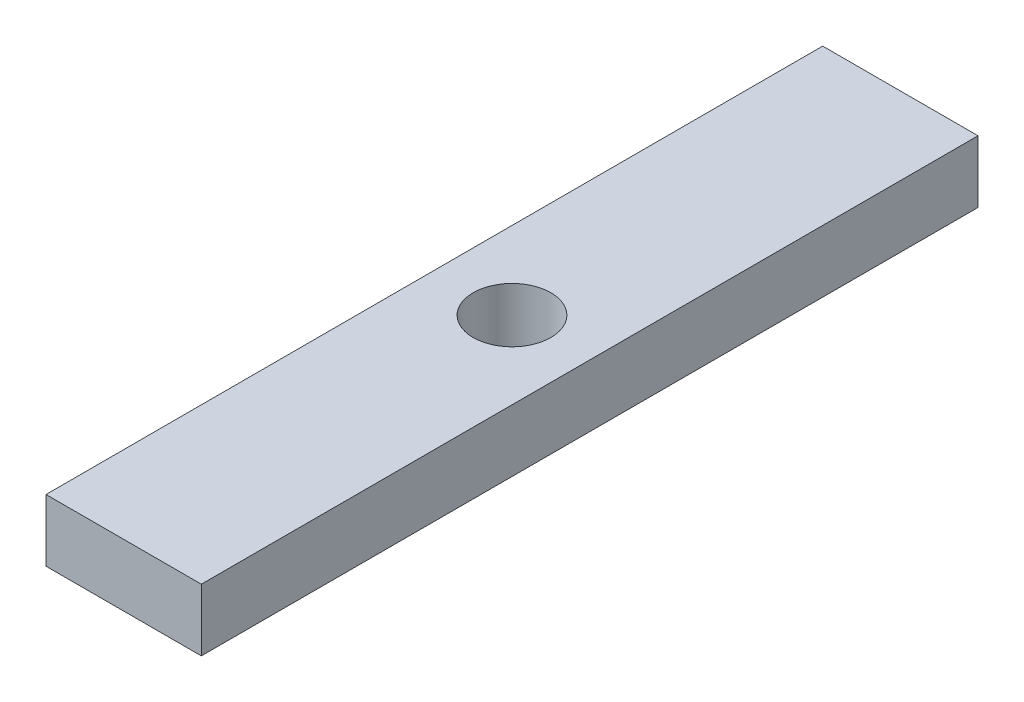
ISO-10303-21;
HEADER;
FILE_DESCRIPTION(('STEP AP214'),'2;1');
FILE_NAME('part.step','',(''),(''),'','','');
FILE_SCHEMA(('AUTOMOTIVE_DESIGN { 1 0 10303 214 1 1 1 1 }'));
ENDSEC;
DATA;
#1=APPLICATION_CONTEXT('core data for automotive mechanical design processes');
#2=APPLICATION_PROTOCOL_DEFINITION('international standard','automotive_design',2000,#1);
#3=PRODUCT_CONTEXT('',#1,'mechanical');
#4=PRODUCT('Part','Part','',(#3));
#5=PRODUCT_RELATED_PRODUCT_CATEGORY('part','',(#4));
#6=PRODUCT_DEFINITION_FORMATION('','',#4);
#7=PRODUCT_DEFINITION_CONTEXT('part definition',#1,'design');
#8=PRODUCT_DEFINITION('design','',#6,#7);
#9=PRODUCT_DEFINITION_SHAPE('','',#8);
#10=(LENGTH_UNIT() NAMED_UNIT(*) SI_UNIT(.MILLI.,.METRE.));
#11=(NAMED_UNIT(*) PLANE_ANGLE_UNIT() SI_UNIT($,.RADIAN.));
#12=(NAMED_UNIT(*) SI_UNIT($,.STERADIAN.) SOLID_ANGLE_UNIT());
#13=UNCERTAINTY_MEASURE_WITH_UNIT(LENGTH_MEASURE(1.E-05),#10,'distance_accuracy_value','');
#14=(GEOMETRIC_REPRESENTATION_CONTEXT(3) GLOBAL_UNCERTAINTY_ASSIGNED_CONTEXT((#13)) GLOBAL_UNIT_ASSIGNED_CONTEXT((#10,
#11,#12)) REPRESENTATION_CONTEXT('',''));
#15=CARTESIAN_POINT('',(0.,0.,0.));
#16=DIRECTION('',(0.,0.,1.));
#17=DIRECTION('',(1.,0.,0.));
#18=AXIS2_PLACEMENT_3D('',#15,#16,#17);
#19=CARTESIAN_POINT('',(-10.,8.,-100.));
#20=DIRECTION('',(1.,0.,0.));
#21=DIRECTION('',(0.,0.,-1.));
#22=AXIS2_PLACEMENT_3D('',#19,#20,#21);
#23=PLANE('',#22);
#24=DIRECTION('',(0.,0.,1.));
#25=VECTOR('',#24,1.);
#26=CARTESIAN_POINT('',(-10.,0.,-100.));
#27=LINE('',#26,#25);
#28=CARTESIAN_POINT('',(-10.,0.,-100.));
#29=VERTEX_POINT('',#28);
#30=CARTESIAN_POINT('',(-10.,0.,0.));
#31=VERTEX_POINT('',#30);
#32=EDGE_CURVE('E106',#29,#31,#27,.T.);
#33=ORIENTED_EDGE('',*,*,#32,.T.);
#34=DIRECTION('',(0.,-1.,0.));
#35=VECTOR('',#34,1.);
#36=CARTESIAN_POINT('',(-10.,8.,0.));
#37=LINE('',#36,#35);
#38=CARTESIAN_POINT('',(-10.,8.,0.));
#39=VERTEX_POINT('',#38);
#40=EDGE_CURVE('E11',#39,#31,#37,.T.);
#41=ORIENTED_EDGE('',*,*,#40,.F.);
#42=DIRECTION('',(0.,0.,1.));
#43=VECTOR('',#42,1.);
#44=CARTESIAN_POINT('',(-10.,8.,-100.));
#45=LINE('',#44,#43);
#46=CARTESIAN_POINT('',(-10.,8.,-100.));
#47=VERTEX_POINT('',#46);
#48=EDGE_CURVE('E93',#47,#39,#45,.T.);
#49=ORIENTED_EDGE('',*,*,#48,.F.);
#50=DIRECTION('',(0.,-1.,0.));
#51=VECTOR('',#50,1.);
#52=CARTESIAN_POINT('',(-10.,8.,-100.));
#53=LINE('',#52,#51);
#54=EDGE_CURVE('E102',#47,#29,#53,.T.);
#55=ORIENTED_EDGE('',*,*,#54,.T.);
#56=EDGE_LOOP('',(#33,#41,#49,#55));
#57=FACE_BOUND('',#56,.T.);
#58=ADVANCED_FACE('F41',(#57),#23,.F.);
#59=CARTESIAN_POINT('',(-10.,8.,0.));
#60=DIRECTION('',(0.,0.,-1.));
#61=DIRECTION('',(-1.,0.,0.));
#62=AXIS2_PLACEMENT_3D('',#59,#60,#61);
#63=PLANE('',#62);
#64=DIRECTION('',(1.,0.,0.));
#65=VECTOR('',#64,1.);
#66=CARTESIAN_POINT('',(-10.,0.,0.));
#67=LINE('',#66,#65);
#68=CARTESIAN_POINT('',(10.,0.,0.));
#69=VERTEX_POINT('',#68);
#70=EDGE_CURVE('E97',#31,#69,#67,.T.);
#71=ORIENTED_EDGE('',*,*,#70,.T.);
#72=DIRECTION('',(0.,-1.,0.));
#73=VECTOR('',#72,1.);
#74=CARTESIAN_POINT('',(10.,8.,0.));
#75=LINE('',#74,#73);
#76=CARTESIAN_POINT('',(10.,8.,0.));
#77=VERTEX_POINT('',#76);
#78=EDGE_CURVE('E50',#77,#69,#75,.T.);
#79=ORIENTED_EDGE('',*,*,#78,.F.);
#80=DIRECTION('',(1.,0.,0.));
#81=VECTOR('',#80,1.);
#82=CARTESIAN_POINT('',(-10.,8.,0.));
#83=LINE('',#82,#81);
#84=EDGE_CURVE('E88',#39,#77,#83,.T.);
#85=ORIENTED_EDGE('',*,*,#84,.F.);
#86=ORIENTED_EDGE('',*,*,#40,.T.);
#87=EDGE_LOOP('',(#71,#79,#85,#86));
#88=FACE_BOUND('',#87,.T.);
#89=ADVANCED_FACE('F96',(#88),#63,.F.);
#90=CARTESIAN_POINT('',(9.99999999999998,8.,-100.));
#91=DIRECTION('',(-1.,0.,0.));
#92=DIRECTION('',(0.,0.,1.));
#93=AXIS2_PLACEMENT_3D('',#90,#91,#92);
#94=PLANE('',#93);
#95=DIRECTION('',(0.,0.,-1.));
#96=VECTOR('',#95,1.);
#97=CARTESIAN_POINT('',(9.99999999999998,0.,-100.));
#98=LINE('',#97,#96);
#99=CARTESIAN_POINT('',(9.99999999999998,0.,-100.));
#100=VERTEX_POINT('',#99);
#101=EDGE_CURVE('E75',#69,#100,#98,.T.);
#102=ORIENTED_EDGE('',*,*,#101,.T.);
#103=DIRECTION('',(0.,-1.,0.));
#104=VECTOR('',#103,1.);
#105=CARTESIAN_POINT('',(9.99999999999998,8.,-100.));
#106=LINE('',#105,#104);
#107=CARTESIAN_POINT('',(9.99999999999998,8.,-100.));
#108=VERTEX_POINT('',#107);
#109=EDGE_CURVE('E98',#108,#100,#106,.T.);
#110=ORIENTED_EDGE('',*,*,#109,.F.);
#111=DIRECTION('',(0.,0.,-1.));
#112=VECTOR('',#111,1.);
#113=CARTESIAN_POINT('',(9.99999999999998,8.,-100.));
#114=LINE('',#113,#112);
#115=EDGE_CURVE('E91',#77,#108,#114,.T.);
#116=ORIENTED_EDGE('',*,*,#115,.F.);
#117=ORIENTED_EDGE('',*,*,#78,.T.);
#118=EDGE_LOOP('',(#102,#110,#116,#117));
#119=FACE_BOUND('',#118,.T.);
#120=ADVANCED_FACE('F100',(#119),#94,.F.);
#121=CARTESIAN_POINT('',(-10.,8.,-100.));
#122=DIRECTION('',(0.,0.,1.));
#123=DIRECTION('',(1.,0.,0.));
#124=AXIS2_PLACEMENT_3D('',#121,#122,#123);
#125=PLANE('',#124);
#126=DIRECTION('',(-1.,0.,0.));
#127=VECTOR('',#126,1.);
#128=CARTESIAN_POINT('',(-10.,0.,-100.));
#129=LINE('',#128,#127);
#130=EDGE_CURVE('E81',#100,#29,#129,.T.);
#131=ORIENTED_EDGE('',*,*,#130,.T.);
#132=ORIENTED_EDGE('',*,*,#54,.F.);
#133=DIRECTION('',(-1.,0.,0.));
#134=VECTOR('',#133,1.);
#135=CARTESIAN_POINT('',(-10.,8.,-100.));
#136=LINE('',#135,#134);
#137=EDGE_CURVE('E58',#108,#47,#136,.T.);
#138=ORIENTED_EDGE('',*,*,#137,.F.);
#139=ORIENTED_EDGE('',*,*,#109,.T.);
#140=EDGE_LOOP('',(#131,#132,#138,#139));
#141=FACE_BOUND('',#140,.T.);
#142=ADVANCED_FACE('F113',(#141),#125,.F.);
#143=CARTESIAN_POINT('',(0.,8.,0.));
#144=DIRECTION('',(0.,1.,0.));
#145=DIRECTION('',(0.,0.,1.));
#146=AXIS2_PLACEMENT_3D('',#143,#144,#145);
#147=PLANE('',#146);
#148=CARTESIAN_POINT('',(0.,8.,-50.));
#149=DIRECTION('',(0.,1.,0.));
#150=DIRECTION('',(0.,0.,1.));
#151=AXIS2_PLACEMENT_3D('',#148,#149,#150);
#152=CIRCLE('',#151,5.);
#153=CARTESIAN_POINT('',(0.,8.,-45.));
#154=VERTEX_POINT('',#153);
#155=EDGE_CURVE('E119',#154,#154,#152,.T.);
#156=ORIENTED_EDGE('',*,*,#155,.F.);
#157=EDGE_LOOP('',(#156));
#158=FACE_BOUND('',#157,.T.);
#159=ORIENTED_EDGE('',*,*,#48,.T.);
#160=ORIENTED_EDGE('',*,*,#84,.T.);
#161=ORIENTED_EDGE('',*,*,#115,.T.);
#162=ORIENTED_EDGE('',*,*,#137,.T.);
#163=EDGE_LOOP('',(#159,#160,#161,#162));
#164=FACE_BOUND('',#163,.T.);
#165=ADVANCED_FACE('F89',(#158,#164),#147,.T.);
#166=CARTESIAN_POINT('',(0.,0.,0.));
#167=DIRECTION('',(0.,1.,0.));
#168=DIRECTION('',(0.,0.,1.));
#169=AXIS2_PLACEMENT_3D('',#166,#167,#168);
#170=PLANE('',#169);
#171=CARTESIAN_POINT('',(0.,0.,-50.));
#172=DIRECTION('',(0.,1.,0.));
#173=DIRECTION('',(0.,0.,1.));
#174=AXIS2_PLACEMENT_3D('',#171,#172,#173);
#175=CIRCLE('',#174,5.);
#176=CARTESIAN_POINT('',(0.,0.,-45.));
#177=VERTEX_POINT('',#176);
#178=EDGE_CURVE('E44',#177,#177,#175,.T.);
#179=ORIENTED_EDGE('',*,*,#178,.T.);
#180=EDGE_LOOP('',(#179));
#181=FACE_BOUND('',#180,.T.);
#182=ORIENTED_EDGE('',*,*,#32,.F.);
#183=ORIENTED_EDGE('',*,*,#130,.F.);
#184=ORIENTED_EDGE('',*,*,#101,.F.);
#185=ORIENTED_EDGE('',*,*,#70,.F.);
#186=EDGE_LOOP('',(#182,#183,#184,#185));
#187=FACE_BOUND('',#186,.T.);
#188=ADVANCED_FACE('F116',(#181,#187),#170,.F.);
#189=CARTESIAN_POINT('',(0.,-2.,-50.));
#190=DIRECTION('',(0.,1.,0.));
#191=DIRECTION('',(0.,0.,1.));
#192=AXIS2_PLACEMENT_3D('',#189,#190,#191);
#193=CYLINDRICAL_SURFACE('',#192,5.);
#194=ORIENTED_EDGE('',*,*,#155,.T.);
#195=EDGE_LOOP('',(#194));
#196=FACE_BOUND('',#195,.T.);
#197=ORIENTED_EDGE('',*,*,#178,.F.);
#198=EDGE_LOOP('',(#197));
#199=FACE_BOUND('',#198,.T.);
#200=ADVANCED_FACE('F127',(#196,#199),#193,.F.);
#201=CLOSED_SHELL('',(#58,#89,#120,#142,#165,#188,#200));
#202=MANIFOLD_SOLID_BREP('B2',#201);
#203=ADVANCED_BREP_SHAPE_REPRESENTATION('',(#18,#202),#14);
#204=SHAPE_DEFINITION_REPRESENTATION(#9,#203);
ENDSEC;
END-ISO-10303-21;
